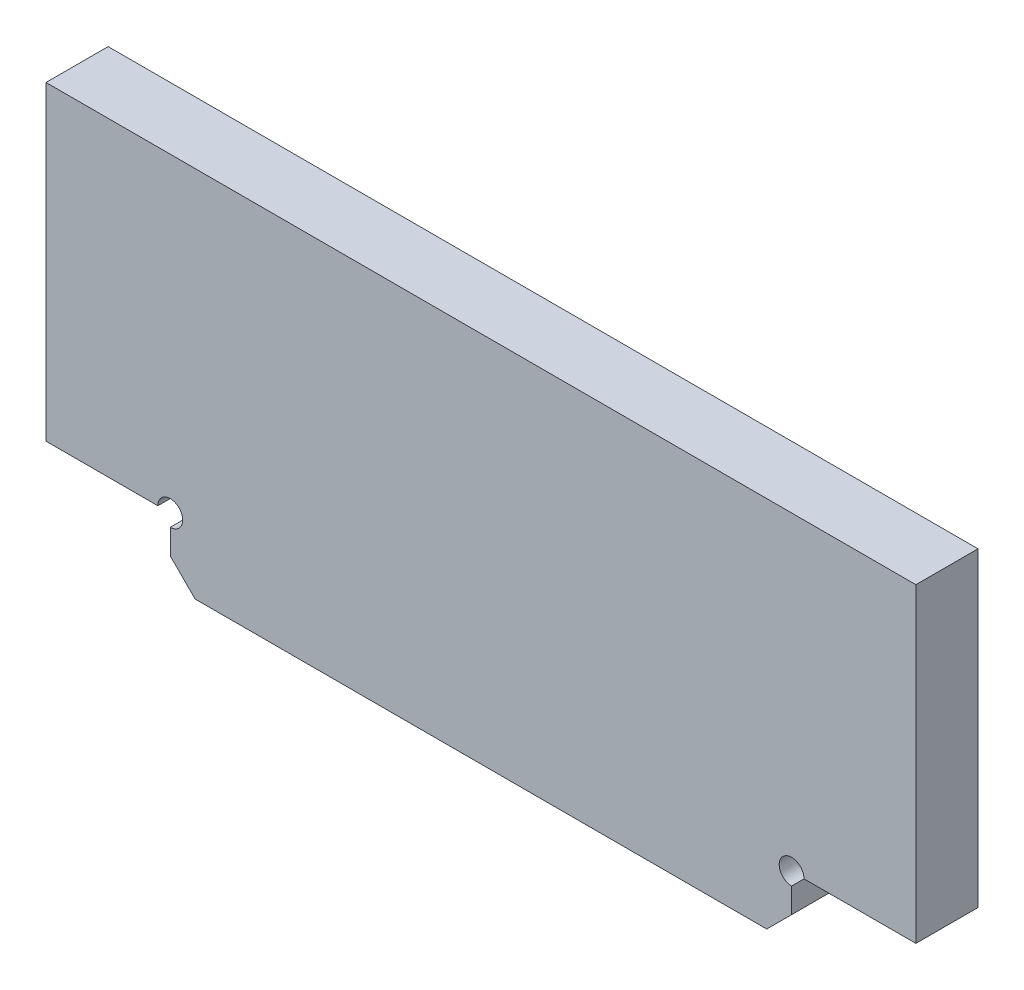
ISO-10303-21;
HEADER;
FILE_DESCRIPTION(('STEP AP214'),'2;1');
FILE_NAME('part.step','',(''),(''),'','','');
FILE_SCHEMA(('AUTOMOTIVE_DESIGN { 1 0 10303 214 1 1 1 1 }'));
ENDSEC;
DATA;
#1=APPLICATION_CONTEXT('core data for automotive mechanical design processes');
#2=APPLICATION_PROTOCOL_DEFINITION('international standard','automotive_design',2000,#1);
#3=PRODUCT_CONTEXT('',#1,'mechanical');
#4=PRODUCT('Part','Part','',(#3));
#5=PRODUCT_RELATED_PRODUCT_CATEGORY('part','',(#4));
#6=PRODUCT_DEFINITION_FORMATION('','',#4);
#7=PRODUCT_DEFINITION_CONTEXT('part definition',#1,'design');
#8=PRODUCT_DEFINITION('design','',#6,#7);
#9=PRODUCT_DEFINITION_SHAPE('','',#8);
#10=(LENGTH_UNIT() NAMED_UNIT(*) SI_UNIT(.MILLI.,.METRE.));
#11=(NAMED_UNIT(*) PLANE_ANGLE_UNIT() SI_UNIT($,.RADIAN.));
#12=(NAMED_UNIT(*) SI_UNIT($,.STERADIAN.) SOLID_ANGLE_UNIT());
#13=UNCERTAINTY_MEASURE_WITH_UNIT(LENGTH_MEASURE(1.E-05),#10,'distance_accuracy_value','');
#14=(GEOMETRIC_REPRESENTATION_CONTEXT(3) GLOBAL_UNCERTAINTY_ASSIGNED_CONTEXT((#13)) GLOBAL_UNIT_ASSIGNED_CONTEXT((#10,
#11,#12)) REPRESENTATION_CONTEXT('',''));
#15=CARTESIAN_POINT('',(0.,0.,0.));
#16=DIRECTION('',(0.,0.,1.));
#17=DIRECTION('',(1.,0.,0.));
#18=AXIS2_PLACEMENT_3D('',#15,#16,#17);
#19=CARTESIAN_POINT('',(35.,5.,2.5));
#20=DIRECTION('',(-1.,0.,0.));
#21=DIRECTION('',(0.,0.,1.));
#22=AXIS2_PLACEMENT_3D('',#19,#20,#21);
#23=PLANE('',#22);
#24=DIRECTION('',(0.,1.,0.));
#25=VECTOR('',#24,1.);
#26=CARTESIAN_POINT('',(35.,5.,-2.5));
#27=LINE('',#26,#25);
#28=CARTESIAN_POINT('',(35.,5.,-2.5));
#29=VERTEX_POINT('',#28);
#30=CARTESIAN_POINT('',(35.,30.,-2.5));
#31=VERTEX_POINT('',#30);
#32=EDGE_CURVE('E152',#29,#31,#27,.T.);
#33=ORIENTED_EDGE('',*,*,#32,.T.);
#34=DIRECTION('',(0.,0.,-1.));
#35=VECTOR('',#34,1.);
#36=CARTESIAN_POINT('',(35.,30.,2.5));
#37=LINE('',#36,#35);
#38=CARTESIAN_POINT('',(35.,30.,2.5));
#39=VERTEX_POINT('',#38);
#40=EDGE_CURVE('E11',#39,#31,#37,.T.);
#41=ORIENTED_EDGE('',*,*,#40,.F.);
#42=DIRECTION('',(0.,1.,0.));
#43=VECTOR('',#42,1.);
#44=CARTESIAN_POINT('',(35.,5.,2.5));
#45=LINE('',#44,#43);
#46=CARTESIAN_POINT('',(35.,5.,2.5));
#47=VERTEX_POINT('',#46);
#48=EDGE_CURVE('E180',#47,#39,#45,.T.);
#49=ORIENTED_EDGE('',*,*,#48,.F.);
#50=DIRECTION('',(0.,0.,-1.));
#51=VECTOR('',#50,1.);
#52=CARTESIAN_POINT('',(35.,5.,2.5));
#53=LINE('',#52,#51);
#54=EDGE_CURVE('E148',#47,#29,#53,.T.);
#55=ORIENTED_EDGE('',*,*,#54,.T.);
#56=EDGE_LOOP('',(#33,#41,#49,#55));
#57=FACE_BOUND('',#56,.T.);
#58=ADVANCED_FACE('F33',(#57),#23,.F.);
#59=CARTESIAN_POINT('',(35.,30.,2.5));
#60=DIRECTION('',(0.,-1.,0.));
#61=DIRECTION('',(1.,0.,0.));
#62=AXIS2_PLACEMENT_3D('',#59,#60,#61);
#63=PLANE('',#62);
#64=DIRECTION('',(-1.,0.,0.));
#65=VECTOR('',#64,1.);
#66=CARTESIAN_POINT('',(35.,30.,-2.5));
#67=LINE('',#66,#65);
#68=CARTESIAN_POINT('',(-35.,30.,-2.5));
#69=VERTEX_POINT('',#68);
#70=EDGE_CURVE('E155',#31,#69,#67,.T.);
#71=ORIENTED_EDGE('',*,*,#70,.T.);
#72=DIRECTION('',(0.,0.,-1.));
#73=VECTOR('',#72,1.);
#74=CARTESIAN_POINT('',(-35.,30.,2.5));
#75=LINE('',#74,#73);
#76=CARTESIAN_POINT('',(-35.,30.,2.5));
#77=VERTEX_POINT('',#76);
#78=EDGE_CURVE('E41',#77,#69,#75,.T.);
#79=ORIENTED_EDGE('',*,*,#78,.F.);
#80=DIRECTION('',(-1.,0.,0.));
#81=VECTOR('',#80,1.);
#82=CARTESIAN_POINT('',(35.,30.,2.5));
#83=LINE('',#82,#81);
#84=EDGE_CURVE('E100',#39,#77,#83,.T.);
#85=ORIENTED_EDGE('',*,*,#84,.F.);
#86=ORIENTED_EDGE('',*,*,#40,.T.);
#87=EDGE_LOOP('',(#71,#79,#85,#86));
#88=FACE_BOUND('',#87,.T.);
#89=ADVANCED_FACE('F203',(#88),#63,.F.);
#90=CARTESIAN_POINT('',(-35.,4.99999999999999,2.5));
#91=DIRECTION('',(-1.,0.,0.));
#92=DIRECTION('',(0.,0.,1.));
#93=AXIS2_PLACEMENT_3D('',#90,#91,#92);
#94=PLANE('',#93);
#95=DIRECTION('',(0.,1.,0.));
#96=VECTOR('',#95,1.);
#97=CARTESIAN_POINT('',(-35.,4.99999999999999,-2.5));
#98=LINE('',#97,#96);
#99=CARTESIAN_POINT('',(-35.,4.99999999999999,-2.5));
#100=VERTEX_POINT('',#99);
#101=EDGE_CURVE('E158',#100,#69,#98,.T.);
#102=ORIENTED_EDGE('',*,*,#101,.F.);
#103=DIRECTION('',(0.,0.,-1.));
#104=VECTOR('',#103,1.);
#105=CARTESIAN_POINT('',(-35.,4.99999999999999,2.5));
#106=LINE('',#105,#104);
#107=CARTESIAN_POINT('',(-35.,4.99999999999999,2.5));
#108=VERTEX_POINT('',#107);
#109=EDGE_CURVE('E196',#108,#100,#106,.T.);
#110=ORIENTED_EDGE('',*,*,#109,.F.);
#111=DIRECTION('',(0.,1.,0.));
#112=VECTOR('',#111,1.);
#113=CARTESIAN_POINT('',(-35.,4.99999999999999,2.5));
#114=LINE('',#113,#112);
#115=EDGE_CURVE('E202',#108,#77,#114,.T.);
#116=ORIENTED_EDGE('',*,*,#115,.T.);
#117=ORIENTED_EDGE('',*,*,#78,.T.);
#118=EDGE_LOOP('',(#102,#110,#116,#117));
#119=FACE_BOUND('',#118,.T.);
#120=ADVANCED_FACE('F200',(#119),#94,.T.);
#121=CARTESIAN_POINT('',(-26.,5.,2.5));
#122=DIRECTION('',(0.,-1.,0.));
#123=DIRECTION('',(1.,0.,0.));
#124=AXIS2_PLACEMENT_3D('',#121,#122,#123);
#125=PLANE('',#124);
#126=DIRECTION('',(-1.,0.,0.));
#127=VECTOR('',#126,1.);
#128=CARTESIAN_POINT('',(-26.,5.,-2.5));
#129=LINE('',#128,#127);
#130=CARTESIAN_POINT('',(-26.,5.,-2.5));
#131=VERTEX_POINT('',#130);
#132=EDGE_CURVE('E161',#131,#100,#129,.T.);
#133=ORIENTED_EDGE('',*,*,#132,.F.);
#134=DIRECTION('',(0.,0.,-1.));
#135=VECTOR('',#134,1.);
#136=CARTESIAN_POINT('',(-26.,5.,2.5));
#137=LINE('',#136,#135);
#138=CARTESIAN_POINT('',(-26.,5.,2.5));
#139=VERTEX_POINT('',#138);
#140=EDGE_CURVE('E194',#139,#131,#137,.T.);
#141=ORIENTED_EDGE('',*,*,#140,.F.);
#142=DIRECTION('',(-1.,0.,0.));
#143=VECTOR('',#142,1.);
#144=CARTESIAN_POINT('',(-26.,5.,2.5));
#145=LINE('',#144,#143);
#146=EDGE_CURVE('E214',#139,#108,#145,.T.);
#147=ORIENTED_EDGE('',*,*,#146,.T.);
#148=ORIENTED_EDGE('',*,*,#109,.T.);
#149=EDGE_LOOP('',(#133,#141,#147,#148));
#150=FACE_BOUND('',#149,.T.);
#151=ADVANCED_FACE('F211',(#150),#125,.T.);
#152=CARTESIAN_POINT('',(-25.,5.,2.5));
#153=DIRECTION('',(0.,0.,-1.));
#154=DIRECTION('',(-1.,0.,0.));
#155=AXIS2_PLACEMENT_3D('',#152,#153,#154);
#156=CYLINDRICAL_SURFACE('',#155,1.);
#157=CARTESIAN_POINT('',(-25.,5.,-2.5));
#158=DIRECTION('',(0.,0.,1.));
#159=DIRECTION('',(1.,0.,0.));
#160=AXIS2_PLACEMENT_3D('',#157,#158,#159);
#161=CIRCLE('',#160,1.);
#162=CARTESIAN_POINT('',(-25.,3.99999999999999,-2.5));
#163=VERTEX_POINT('',#162);
#164=EDGE_CURVE('E164',#163,#131,#161,.T.);
#165=ORIENTED_EDGE('',*,*,#164,.F.);
#166=DIRECTION('',(0.,0.,-1.));
#167=VECTOR('',#166,1.);
#168=CARTESIAN_POINT('',(-25.,3.99999999999999,2.5));
#169=LINE('',#168,#167);
#170=CARTESIAN_POINT('',(-25.,3.99999999999999,2.5));
#171=VERTEX_POINT('',#170);
#172=EDGE_CURVE('E192',#171,#163,#169,.T.);
#173=ORIENTED_EDGE('',*,*,#172,.F.);
#174=CARTESIAN_POINT('',(-25.,5.,2.5));
#175=DIRECTION('',(0.,0.,1.));
#176=DIRECTION('',(1.,0.,0.));
#177=AXIS2_PLACEMENT_3D('',#174,#175,#176);
#178=CIRCLE('',#177,1.);
#179=EDGE_CURVE('E218',#171,#139,#178,.T.);
#180=ORIENTED_EDGE('',*,*,#179,.T.);
#181=ORIENTED_EDGE('',*,*,#140,.T.);
#182=EDGE_LOOP('',(#165,#173,#180,#181));
#183=FACE_BOUND('',#182,.T.);
#184=ADVANCED_FACE('F264',(#183),#156,.F.);
#185=CARTESIAN_POINT('',(-25.,2.,2.5));
#186=DIRECTION('',(-1.,0.,0.));
#187=DIRECTION('',(0.,0.,1.));
#188=AXIS2_PLACEMENT_3D('',#185,#186,#187);
#189=PLANE('',#188);
#190=DIRECTION('',(0.,1.,0.));
#191=VECTOR('',#190,1.);
#192=CARTESIAN_POINT('',(-25.,2.,-2.5));
#193=LINE('',#192,#191);
#194=CARTESIAN_POINT('',(-25.,2.,-2.5));
#195=VERTEX_POINT('',#194);
#196=EDGE_CURVE('E167',#195,#163,#193,.T.);
#197=ORIENTED_EDGE('',*,*,#196,.F.);
#198=DIRECTION('',(0.,0.,-1.));
#199=VECTOR('',#198,1.);
#200=CARTESIAN_POINT('',(-25.,2.,2.5));
#201=LINE('',#200,#199);
#202=CARTESIAN_POINT('',(-25.,2.,2.5));
#203=VERTEX_POINT('',#202);
#204=EDGE_CURVE('E190',#203,#195,#201,.T.);
#205=ORIENTED_EDGE('',*,*,#204,.F.);
#206=DIRECTION('',(0.,1.,0.));
#207=VECTOR('',#206,1.);
#208=CARTESIAN_POINT('',(-25.,2.,2.5));
#209=LINE('',#208,#207);
#210=EDGE_CURVE('E224',#203,#171,#209,.T.);
#211=ORIENTED_EDGE('',*,*,#210,.T.);
#212=ORIENTED_EDGE('',*,*,#172,.T.);
#213=EDGE_LOOP('',(#197,#205,#211,#212));
#214=FACE_BOUND('',#213,.T.);
#215=ADVANCED_FACE('F267',(#214),#189,.T.);
#216=CARTESIAN_POINT('',(-25.,2.,2.5));
#217=DIRECTION('',(0.707106781186547,0.707106781186548,0.));
#218=DIRECTION('',(-0.707106781186548,0.707106781186547,0.));
#219=AXIS2_PLACEMENT_3D('',#216,#217,#218);
#220=PLANE('',#219);
#221=DIRECTION('',(0.707106781186548,-0.707106781186547,0.));
#222=VECTOR('',#221,1.);
#223=CARTESIAN_POINT('',(-25.,2.,-2.5));
#224=LINE('',#223,#222);
#225=CARTESIAN_POINT('',(-23.,0.,-2.5));
#226=VERTEX_POINT('',#225);
#227=EDGE_CURVE('E170',#195,#226,#224,.T.);
#228=ORIENTED_EDGE('',*,*,#227,.T.);
#229=DIRECTION('',(0.,0.,-1.));
#230=VECTOR('',#229,1.);
#231=CARTESIAN_POINT('',(-23.,0.,2.5));
#232=LINE('',#231,#230);
#233=CARTESIAN_POINT('',(-23.,0.,2.5));
#234=VERTEX_POINT('',#233);
#235=EDGE_CURVE('E187',#234,#226,#232,.T.);
#236=ORIENTED_EDGE('',*,*,#235,.F.);
#237=DIRECTION('',(0.707106781186548,-0.707106781186547,0.));
#238=VECTOR('',#237,1.);
#239=CARTESIAN_POINT('',(-25.,2.,2.5));
#240=LINE('',#239,#238);
#241=EDGE_CURVE('E227',#203,#234,#240,.T.);
#242=ORIENTED_EDGE('',*,*,#241,.F.);
#243=ORIENTED_EDGE('',*,*,#204,.T.);
#244=EDGE_LOOP('',(#228,#236,#242,#243));
#245=FACE_BOUND('',#244,.T.);
#246=ADVANCED_FACE('F271',(#245),#220,.F.);
#247=CARTESIAN_POINT('',(-23.,0.,2.5));
#248=DIRECTION('',(0.,1.,0.));
#249=DIRECTION('',(0.,0.,1.));
#250=AXIS2_PLACEMENT_3D('',#247,#248,#249);
#251=PLANE('',#250);
#252=DIRECTION('',(1.,0.,0.));
#253=VECTOR('',#252,1.);
#254=CARTESIAN_POINT('',(-23.,0.,-2.5));
#255=LINE('',#254,#253);
#256=CARTESIAN_POINT('',(23.,0.,-2.5));
#257=VERTEX_POINT('',#256);
#258=EDGE_CURVE('E172',#226,#257,#255,.T.);
#259=ORIENTED_EDGE('',*,*,#258,.T.);
#260=DIRECTION('',(0.,0.,-1.));
#261=VECTOR('',#260,1.);
#262=CARTESIAN_POINT('',(23.,0.,2.5));
#263=LINE('',#262,#261);
#264=CARTESIAN_POINT('',(23.,0.,2.5));
#265=VERTEX_POINT('',#264);
#266=EDGE_CURVE('E184',#265,#257,#263,.T.);
#267=ORIENTED_EDGE('',*,*,#266,.F.);
#268=DIRECTION('',(1.,0.,0.));
#269=VECTOR('',#268,1.);
#270=CARTESIAN_POINT('',(-23.,0.,2.5));
#271=LINE('',#270,#269);
#272=EDGE_CURVE('E229',#234,#265,#271,.T.);
#273=ORIENTED_EDGE('',*,*,#272,.F.);
#274=ORIENTED_EDGE('',*,*,#235,.T.);
#275=EDGE_LOOP('',(#259,#267,#273,#274));
#276=FACE_BOUND('',#275,.T.);
#277=ADVANCED_FACE('F236',(#276),#251,.F.);
#278=CARTESIAN_POINT('',(23.,0.,2.5));
#279=DIRECTION('',(-0.707106781186546,0.707106781186549,0.));
#280=DIRECTION('',(-0.707106781186549,-0.707106781186546,0.));
#281=AXIS2_PLACEMENT_3D('',#278,#279,#280);
#282=PLANE('',#281);
#283=DIRECTION('',(0.707106781186549,0.707106781186546,0.));
#284=VECTOR('',#283,1.);
#285=CARTESIAN_POINT('',(23.,0.,-2.5));
#286=LINE('',#285,#284);
#287=CARTESIAN_POINT('',(25.,2.,-2.5));
#288=VERTEX_POINT('',#287);
#289=EDGE_CURVE('E174',#257,#288,#286,.T.);
#290=ORIENTED_EDGE('',*,*,#289,.T.);
#291=DIRECTION('',(0.,0.,-1.));
#292=VECTOR('',#291,1.);
#293=CARTESIAN_POINT('',(25.,2.,2.5));
#294=LINE('',#293,#292);
#295=CARTESIAN_POINT('',(25.,2.,2.5));
#296=VERTEX_POINT('',#295);
#297=EDGE_CURVE('E144',#296,#288,#294,.T.);
#298=ORIENTED_EDGE('',*,*,#297,.F.);
#299=DIRECTION('',(0.707106781186549,0.707106781186546,0.));
#300=VECTOR('',#299,1.);
#301=CARTESIAN_POINT('',(23.,0.,2.5));
#302=LINE('',#301,#300);
#303=EDGE_CURVE('E131',#265,#296,#302,.T.);
#304=ORIENTED_EDGE('',*,*,#303,.F.);
#305=ORIENTED_EDGE('',*,*,#266,.T.);
#306=EDGE_LOOP('',(#290,#298,#304,#305));
#307=FACE_BOUND('',#306,.T.);
#308=ADVANCED_FACE('F240',(#307),#282,.F.);
#309=CARTESIAN_POINT('',(25.,2.,2.5));
#310=DIRECTION('',(-1.,0.,0.));
#311=DIRECTION('',(0.,0.,1.));
#312=AXIS2_PLACEMENT_3D('',#309,#310,#311);
#313=PLANE('',#312);
#314=DIRECTION('',(0.,1.,0.));
#315=VECTOR('',#314,1.);
#316=CARTESIAN_POINT('',(25.,2.,-2.5));
#317=LINE('',#316,#315);
#318=CARTESIAN_POINT('',(25.,4.,-2.5));
#319=VERTEX_POINT('',#318);
#320=EDGE_CURVE('E140',#288,#319,#317,.T.);
#321=ORIENTED_EDGE('',*,*,#320,.T.);
#322=DIRECTION('',(0.,0.,-1.));
#323=VECTOR('',#322,1.);
#324=CARTESIAN_POINT('',(25.,4.,2.5));
#325=LINE('',#324,#323);
#326=CARTESIAN_POINT('',(25.,4.,2.5));
#327=VERTEX_POINT('',#326);
#328=EDGE_CURVE('E137',#327,#319,#325,.T.);
#329=ORIENTED_EDGE('',*,*,#328,.F.);
#330=DIRECTION('',(0.,1.,0.));
#331=VECTOR('',#330,1.);
#332=CARTESIAN_POINT('',(25.,2.,2.5));
#333=LINE('',#332,#331);
#334=EDGE_CURVE('E125',#296,#327,#333,.T.);
#335=ORIENTED_EDGE('',*,*,#334,.F.);
#336=ORIENTED_EDGE('',*,*,#297,.T.);
#337=EDGE_LOOP('',(#321,#329,#335,#336));
#338=FACE_BOUND('',#337,.T.);
#339=ADVANCED_FACE('F138',(#338),#313,.F.);
#340=CARTESIAN_POINT('',(25.,5.,2.5));
#341=DIRECTION('',(0.,0.,-1.));
#342=DIRECTION('',(-1.,0.,0.));
#343=AXIS2_PLACEMENT_3D('',#340,#341,#342);
#344=CYLINDRICAL_SURFACE('',#343,0.999999999999997);
#345=CARTESIAN_POINT('',(25.,5.,-2.5));
#346=DIRECTION('',(0.,0.,1.));
#347=DIRECTION('',(1.,0.,0.));
#348=AXIS2_PLACEMENT_3D('',#345,#346,#347);
#349=CIRCLE('',#348,0.999999999999997);
#350=CARTESIAN_POINT('',(26.,4.99999999999999,-2.5));
#351=VERTEX_POINT('',#350);
#352=EDGE_CURVE('E177',#351,#319,#349,.T.);
#353=ORIENTED_EDGE('',*,*,#352,.F.);
#354=DIRECTION('',(0.,0.,-1.));
#355=VECTOR('',#354,1.);
#356=CARTESIAN_POINT('',(26.,4.99999999999999,2.5));
#357=LINE('',#356,#355);
#358=CARTESIAN_POINT('',(26.,4.99999999999999,2.5));
#359=VERTEX_POINT('',#358);
#360=EDGE_CURVE('E89',#359,#351,#357,.T.);
#361=ORIENTED_EDGE('',*,*,#360,.F.);
#362=CARTESIAN_POINT('',(25.,5.,2.5));
#363=DIRECTION('',(0.,0.,1.));
#364=DIRECTION('',(1.,0.,0.));
#365=AXIS2_PLACEMENT_3D('',#362,#363,#364);
#366=CIRCLE('',#365,0.999999999999997);
#367=EDGE_CURVE('E129',#359,#327,#366,.T.);
#368=ORIENTED_EDGE('',*,*,#367,.T.);
#369=ORIENTED_EDGE('',*,*,#328,.T.);
#370=EDGE_LOOP('',(#353,#361,#368,#369));
#371=FACE_BOUND('',#370,.T.);
#372=ADVANCED_FACE('F146',(#371),#344,.F.);
#373=CARTESIAN_POINT('',(26.,4.99999999999999,2.5));
#374=DIRECTION('',(0.,1.,0.));
#375=DIRECTION('',(-1.,0.,0.));
#376=AXIS2_PLACEMENT_3D('',#373,#374,#375);
#377=PLANE('',#376);
#378=DIRECTION('',(1.,0.,0.));
#379=VECTOR('',#378,1.);
#380=CARTESIAN_POINT('',(26.,4.99999999999999,-2.5));
#381=LINE('',#380,#379);
#382=EDGE_CURVE('E92',#351,#29,#381,.T.);
#383=ORIENTED_EDGE('',*,*,#382,.T.);
#384=ORIENTED_EDGE('',*,*,#54,.F.);
#385=DIRECTION('',(1.,0.,0.));
#386=VECTOR('',#385,1.);
#387=CARTESIAN_POINT('',(26.,4.99999999999999,2.5));
#388=LINE('',#387,#386);
#389=EDGE_CURVE('E49',#359,#47,#388,.T.);
#390=ORIENTED_EDGE('',*,*,#389,.F.);
#391=ORIENTED_EDGE('',*,*,#360,.T.);
#392=EDGE_LOOP('',(#383,#384,#390,#391));
#393=FACE_BOUND('',#392,.T.);
#394=ADVANCED_FACE('F243',(#393),#377,.F.);
#395=CARTESIAN_POINT('',(-25.,5.,2.5));
#396=DIRECTION('',(0.,0.,1.));
#397=DIRECTION('',(1.,0.,0.));
#398=AXIS2_PLACEMENT_3D('',#395,#396,#397);
#399=PLANE('',#398);
#400=ORIENTED_EDGE('',*,*,#48,.T.);
#401=ORIENTED_EDGE('',*,*,#84,.T.);
#402=ORIENTED_EDGE('',*,*,#115,.F.);
#403=ORIENTED_EDGE('',*,*,#146,.F.);
#404=ORIENTED_EDGE('',*,*,#179,.F.);
#405=ORIENTED_EDGE('',*,*,#210,.F.);
#406=ORIENTED_EDGE('',*,*,#241,.T.);
#407=ORIENTED_EDGE('',*,*,#272,.T.);
#408=ORIENTED_EDGE('',*,*,#303,.T.);
#409=ORIENTED_EDGE('',*,*,#334,.T.);
#410=ORIENTED_EDGE('',*,*,#367,.F.);
#411=ORIENTED_EDGE('',*,*,#389,.T.);
#412=EDGE_LOOP('',(#400,#401,#402,#403,#404,#405,#406,#407,#408,#409,#410,#411));
#413=FACE_BOUND('',#412,.T.);
#414=ADVANCED_FACE('F127',(#413),#399,.T.);
#415=CARTESIAN_POINT('',(-25.,5.,-2.5));
#416=DIRECTION('',(0.,0.,1.));
#417=DIRECTION('',(1.,0.,0.));
#418=AXIS2_PLACEMENT_3D('',#415,#416,#417);
#419=PLANE('',#418);
#420=ORIENTED_EDGE('',*,*,#32,.F.);
#421=ORIENTED_EDGE('',*,*,#382,.F.);
#422=ORIENTED_EDGE('',*,*,#352,.T.);
#423=ORIENTED_EDGE('',*,*,#320,.F.);
#424=ORIENTED_EDGE('',*,*,#289,.F.);
#425=ORIENTED_EDGE('',*,*,#258,.F.);
#426=ORIENTED_EDGE('',*,*,#227,.F.);
#427=ORIENTED_EDGE('',*,*,#196,.T.);
#428=ORIENTED_EDGE('',*,*,#164,.T.);
#429=ORIENTED_EDGE('',*,*,#132,.T.);
#430=ORIENTED_EDGE('',*,*,#101,.T.);
#431=ORIENTED_EDGE('',*,*,#70,.F.);
#432=EDGE_LOOP('',(#420,#421,#422,#423,#424,#425,#426,#427,#428,#429,#430,#431));
#433=FACE_BOUND('',#432,.T.);
#434=ADVANCED_FACE('F207',(#433),#419,.F.);
#435=CLOSED_SHELL('',(#58,#89,#120,#151,#184,#215,#246,#277,#308,#339,#372,#394,#414,#434));
#436=MANIFOLD_SOLID_BREP('B2',#435);
#437=ADVANCED_BREP_SHAPE_REPRESENTATION('',(#18,#436),#14);
#438=SHAPE_DEFINITION_REPRESENTATION(#9,#437);
ENDSEC;
END-ISO-10303-21;
